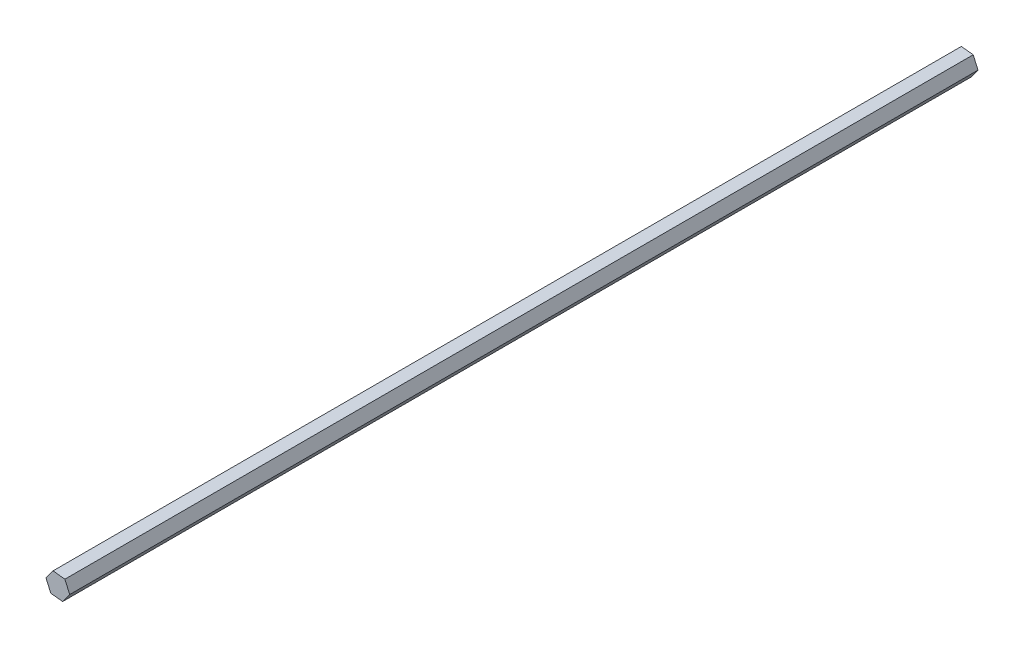
ISO-10303-21;
HEADER;
FILE_DESCRIPTION(('STEP AP214'),'2;1');
FILE_NAME('part.step','',(''),(''),'','','');
FILE_SCHEMA(('AUTOMOTIVE_DESIGN { 1 0 10303 214 1 1 1 1 }'));
ENDSEC;
DATA;
#1=APPLICATION_CONTEXT('core data for automotive mechanical design processes');
#2=APPLICATION_PROTOCOL_DEFINITION('international standard','automotive_design',2000,#1);
#3=PRODUCT_CONTEXT('',#1,'mechanical');
#4=PRODUCT('Part','Part','',(#3));
#5=PRODUCT_RELATED_PRODUCT_CATEGORY('part','',(#4));
#6=PRODUCT_DEFINITION_FORMATION('','',#4);
#7=PRODUCT_DEFINITION_CONTEXT('part definition',#1,'design');
#8=PRODUCT_DEFINITION('design','',#6,#7);
#9=PRODUCT_DEFINITION_SHAPE('','',#8);
#10=(LENGTH_UNIT() NAMED_UNIT(*) SI_UNIT(.MILLI.,.METRE.));
#11=(NAMED_UNIT(*) PLANE_ANGLE_UNIT() SI_UNIT($,.RADIAN.));
#12=(NAMED_UNIT(*) SI_UNIT($,.STERADIAN.) SOLID_ANGLE_UNIT());
#13=UNCERTAINTY_MEASURE_WITH_UNIT(LENGTH_MEASURE(1.E-05),#10,'distance_accuracy_value','');
#14=(GEOMETRIC_REPRESENTATION_CONTEXT(3) GLOBAL_UNCERTAINTY_ASSIGNED_CONTEXT((#13)) GLOBAL_UNIT_ASSIGNED_CONTEXT((#10,
#11,#12)) REPRESENTATION_CONTEXT('',''));
#15=CARTESIAN_POINT('',(0.,0.,0.));
#16=DIRECTION('',(0.,0.,1.));
#17=DIRECTION('',(1.,0.,0.));
#18=AXIS2_PLACEMENT_3D('',#15,#16,#17);
#19=CARTESIAN_POINT('',(7.28894855213655,-0.796594211402432,558.8));
#20=DIRECTION('',(-0.91521997258165,-0.402954590230269,0.));
#21=DIRECTION('',(0.402954590230269,-0.91521997258165,0.));
#22=AXIS2_PLACEMENT_3D('',#19,#20,#21);
#23=PLANE('',#22);
#24=DIRECTION('',(-0.402954590230269,0.91521997258165,0.));
#25=VECTOR('',#24,1.);
#26=CARTESIAN_POINT('',(7.28894855213655,-0.796594211402432,0.));
#27=LINE('',#26,#25);
#28=CARTESIAN_POINT('',(7.28894855213655,-0.796594211402432,0.));
#29=VERTEX_POINT('',#28);
#30=CARTESIAN_POINT('',(4.33434509965041,5.91411750732684,0.));
#31=VERTEX_POINT('',#30);
#32=EDGE_CURVE('E116',#29,#31,#27,.T.);
#33=ORIENTED_EDGE('',*,*,#32,.T.);
#34=DIRECTION('',(0.,0.,-1.));
#35=VECTOR('',#34,1.);
#36=CARTESIAN_POINT('',(4.33434509965041,5.91411750732684,558.8));
#37=LINE('',#36,#35);
#38=CARTESIAN_POINT('',(4.33434509965041,5.91411750732684,558.8));
#39=VERTEX_POINT('',#38);
#40=EDGE_CURVE('E11',#39,#31,#37,.T.);
#41=ORIENTED_EDGE('',*,*,#40,.F.);
#42=DIRECTION('',(-0.402954590230269,0.91521997258165,0.));
#43=VECTOR('',#42,1.);
#44=CARTESIAN_POINT('',(7.28894855213655,-0.796594211402432,558.8));
#45=LINE('',#44,#43);
#46=CARTESIAN_POINT('',(7.28894855213655,-0.796594211402432,558.8));
#47=VERTEX_POINT('',#46);
#48=EDGE_CURVE('E126',#47,#39,#45,.T.);
#49=ORIENTED_EDGE('',*,*,#48,.F.);
#50=DIRECTION('',(0.,0.,-1.));
#51=VECTOR('',#50,1.);
#52=CARTESIAN_POINT('',(7.28894855213655,-0.796594211402432,558.8));
#53=LINE('',#52,#51);
#54=EDGE_CURVE('E112',#47,#29,#53,.T.);
#55=ORIENTED_EDGE('',*,*,#54,.T.);
#56=EDGE_LOOP('',(#33,#41,#49,#55));
#57=FACE_BOUND('',#56,.T.);
#58=ADVANCED_FACE('F32',(#57),#23,.F.);
#59=CARTESIAN_POINT('',(4.33434509965041,5.91411750732684,558.8));
#60=DIRECTION('',(-0.108641074579864,-0.994081041421741,0.));
#61=DIRECTION('',(0.994081041421741,-0.108641074579864,0.));
#62=AXIS2_PLACEMENT_3D('',#59,#60,#61);
#63=PLANE('',#62);
#64=DIRECTION('',(-0.994081041421741,0.108641074579864,0.));
#65=VECTOR('',#64,1.);
#66=CARTESIAN_POINT('',(4.33434509965041,5.91411750732684,0.));
#67=LINE('',#66,#65);
#68=CARTESIAN_POINT('',(-2.95460345248614,6.71071171872927,0.));
#69=VERTEX_POINT('',#68);
#70=EDGE_CURVE('E119',#31,#69,#67,.T.);
#71=ORIENTED_EDGE('',*,*,#70,.T.);
#72=DIRECTION('',(0.,0.,-1.));
#73=VECTOR('',#72,1.);
#74=CARTESIAN_POINT('',(-2.95460345248614,6.71071171872927,558.8));
#75=LINE('',#74,#73);
#76=CARTESIAN_POINT('',(-2.95460345248614,6.71071171872927,558.8));
#77=VERTEX_POINT('',#76);
#78=EDGE_CURVE('E40',#77,#69,#75,.T.);
#79=ORIENTED_EDGE('',*,*,#78,.F.);
#80=DIRECTION('',(-0.994081041421741,0.108641074579864,0.));
#81=VECTOR('',#80,1.);
#82=CARTESIAN_POINT('',(4.33434509965041,5.91411750732684,558.8));
#83=LINE('',#82,#81);
#84=EDGE_CURVE('E85',#39,#77,#83,.T.);
#85=ORIENTED_EDGE('',*,*,#84,.F.);
#86=ORIENTED_EDGE('',*,*,#40,.T.);
#87=EDGE_LOOP('',(#71,#79,#85,#86));
#88=FACE_BOUND('',#87,.T.);
#89=ADVANCED_FACE('F150',(#88),#63,.F.);
#90=CARTESIAN_POINT('',(-2.95460345248614,6.71071171872927,558.8));
#91=DIRECTION('',(0.806578898001786,-0.591126451191472,0.));
#92=DIRECTION('',(0.591126451191472,0.806578898001786,0.));
#93=AXIS2_PLACEMENT_3D('',#90,#91,#92);
#94=PLANE('',#93);
#95=DIRECTION('',(-0.591126451191472,-0.806578898001786,0.));
#96=VECTOR('',#95,1.);
#97=CARTESIAN_POINT('',(-2.95460345248614,6.71071171872927,0.));
#98=LINE('',#97,#96);
#99=CARTESIAN_POINT('',(-7.28894855213655,0.796594211402431,0.));
#100=VERTEX_POINT('',#99);
#101=EDGE_CURVE('E121',#69,#100,#98,.T.);
#102=ORIENTED_EDGE('',*,*,#101,.T.);
#103=DIRECTION('',(0.,0.,-1.));
#104=VECTOR('',#103,1.);
#105=CARTESIAN_POINT('',(-7.28894855213655,0.796594211402431,558.8));
#106=LINE('',#105,#104);
#107=CARTESIAN_POINT('',(-7.28894855213655,0.796594211402431,558.8));
#108=VERTEX_POINT('',#107);
#109=EDGE_CURVE('E107',#108,#100,#106,.T.);
#110=ORIENTED_EDGE('',*,*,#109,.F.);
#111=DIRECTION('',(-0.591126451191472,-0.806578898001786,0.));
#112=VECTOR('',#111,1.);
#113=CARTESIAN_POINT('',(-2.95460345248614,6.71071171872927,558.8));
#114=LINE('',#113,#112);
#115=EDGE_CURVE('E98',#77,#108,#114,.T.);
#116=ORIENTED_EDGE('',*,*,#115,.F.);
#117=ORIENTED_EDGE('',*,*,#78,.T.);
#118=EDGE_LOOP('',(#102,#110,#116,#117));
#119=FACE_BOUND('',#118,.T.);
#120=ADVANCED_FACE('F132',(#119),#94,.F.);
#121=CARTESIAN_POINT('',(-7.28894855213655,0.796594211402431,558.8));
#122=DIRECTION('',(0.91521997258165,0.402954590230269,0.));
#123=DIRECTION('',(-0.402954590230269,0.91521997258165,0.));
#124=AXIS2_PLACEMENT_3D('',#121,#122,#123);
#125=PLANE('',#124);
#126=DIRECTION('',(0.402954590230269,-0.91521997258165,0.));
#127=VECTOR('',#126,1.);
#128=CARTESIAN_POINT('',(-7.28894855213655,0.796594211402431,0.));
#129=LINE('',#128,#127);
#130=CARTESIAN_POINT('',(-4.33434509965041,-5.91411750732684,0.));
#131=VERTEX_POINT('',#130);
#132=EDGE_CURVE('E106',#100,#131,#129,.T.);
#133=ORIENTED_EDGE('',*,*,#132,.T.);
#134=DIRECTION('',(0.,0.,-1.));
#135=VECTOR('',#134,1.);
#136=CARTESIAN_POINT('',(-4.33434509965041,-5.91411750732684,558.8));
#137=LINE('',#136,#135);
#138=CARTESIAN_POINT('',(-4.33434509965041,-5.91411750732684,558.8));
#139=VERTEX_POINT('',#138);
#140=EDGE_CURVE('E103',#139,#131,#137,.T.);
#141=ORIENTED_EDGE('',*,*,#140,.F.);
#142=DIRECTION('',(0.402954590230269,-0.91521997258165,0.));
#143=VECTOR('',#142,1.);
#144=CARTESIAN_POINT('',(-7.28894855213655,0.796594211402431,558.8));
#145=LINE('',#144,#143);
#146=EDGE_CURVE('E92',#108,#139,#145,.T.);
#147=ORIENTED_EDGE('',*,*,#146,.F.);
#148=ORIENTED_EDGE('',*,*,#109,.T.);
#149=EDGE_LOOP('',(#133,#141,#147,#148));
#150=FACE_BOUND('',#149,.T.);
#151=ADVANCED_FACE('F104',(#150),#125,.F.);
#152=CARTESIAN_POINT('',(-4.33434509965041,-5.91411750732684,558.8));
#153=DIRECTION('',(0.108641074579864,0.994081041421741,0.));
#154=DIRECTION('',(-0.994081041421741,0.108641074579864,0.));
#155=AXIS2_PLACEMENT_3D('',#152,#153,#154);
#156=PLANE('',#155);
#157=DIRECTION('',(0.994081041421741,-0.108641074579864,0.));
#158=VECTOR('',#157,1.);
#159=CARTESIAN_POINT('',(-4.33434509965041,-5.91411750732684,0.));
#160=LINE('',#159,#158);
#161=CARTESIAN_POINT('',(2.95460345248614,-6.71071171872927,0.));
#162=VERTEX_POINT('',#161);
#163=EDGE_CURVE('E71',#131,#162,#160,.T.);
#164=ORIENTED_EDGE('',*,*,#163,.T.);
#165=DIRECTION('',(0.,0.,-1.));
#166=VECTOR('',#165,1.);
#167=CARTESIAN_POINT('',(2.95460345248614,-6.71071171872927,558.8));
#168=LINE('',#167,#166);
#169=CARTESIAN_POINT('',(2.95460345248614,-6.71071171872927,558.8));
#170=VERTEX_POINT('',#169);
#171=EDGE_CURVE('E108',#170,#162,#168,.T.);
#172=ORIENTED_EDGE('',*,*,#171,.F.);
#173=DIRECTION('',(0.994081041421741,-0.108641074579864,0.));
#174=VECTOR('',#173,1.);
#175=CARTESIAN_POINT('',(-4.33434509965041,-5.91411750732684,558.8));
#176=LINE('',#175,#174);
#177=EDGE_CURVE('E96',#139,#170,#176,.T.);
#178=ORIENTED_EDGE('',*,*,#177,.F.);
#179=ORIENTED_EDGE('',*,*,#140,.T.);
#180=EDGE_LOOP('',(#164,#172,#178,#179));
#181=FACE_BOUND('',#180,.T.);
#182=ADVANCED_FACE('F110',(#181),#156,.F.);
#183=CARTESIAN_POINT('',(2.95460345248614,-6.71071171872927,558.8));
#184=DIRECTION('',(-0.806578898001786,0.591126451191472,0.));
#185=DIRECTION('',(-0.591126451191472,-0.806578898001786,0.));
#186=AXIS2_PLACEMENT_3D('',#183,#184,#185);
#187=PLANE('',#186);
#188=DIRECTION('',(0.591126451191472,0.806578898001786,0.));
#189=VECTOR('',#188,1.);
#190=CARTESIAN_POINT('',(2.95460345248614,-6.71071171872927,0.));
#191=LINE('',#190,#189);
#192=EDGE_CURVE('E77',#162,#29,#191,.T.);
#193=ORIENTED_EDGE('',*,*,#192,.T.);
#194=ORIENTED_EDGE('',*,*,#54,.F.);
#195=DIRECTION('',(0.591126451191472,0.806578898001786,0.));
#196=VECTOR('',#195,1.);
#197=CARTESIAN_POINT('',(2.95460345248614,-6.71071171872927,558.8));
#198=LINE('',#197,#196);
#199=EDGE_CURVE('E48',#170,#47,#198,.T.);
#200=ORIENTED_EDGE('',*,*,#199,.F.);
#201=ORIENTED_EDGE('',*,*,#171,.T.);
#202=EDGE_LOOP('',(#193,#194,#200,#201));
#203=FACE_BOUND('',#202,.T.);
#204=ADVANCED_FACE('F139',(#203),#187,.F.);
#205=CARTESIAN_POINT('',(0.,0.,558.8));
#206=DIRECTION('',(0.,0.,1.));
#207=DIRECTION('',(1.,0.,0.));
#208=AXIS2_PLACEMENT_3D('',#205,#206,#207);
#209=PLANE('',#208);
#210=ORIENTED_EDGE('',*,*,#48,.T.);
#211=ORIENTED_EDGE('',*,*,#84,.T.);
#212=ORIENTED_EDGE('',*,*,#115,.T.);
#213=ORIENTED_EDGE('',*,*,#146,.T.);
#214=ORIENTED_EDGE('',*,*,#177,.T.);
#215=ORIENTED_EDGE('',*,*,#199,.T.);
#216=EDGE_LOOP('',(#210,#211,#212,#213,#214,#215));
#217=FACE_BOUND('',#216,.T.);
#218=ADVANCED_FACE('F94',(#217),#209,.T.);
#219=CARTESIAN_POINT('',(0.,0.,0.));
#220=DIRECTION('',(0.,0.,1.));
#221=DIRECTION('',(1.,0.,0.));
#222=AXIS2_PLACEMENT_3D('',#219,#220,#221);
#223=PLANE('',#222);
#224=ORIENTED_EDGE('',*,*,#32,.F.);
#225=ORIENTED_EDGE('',*,*,#192,.F.);
#226=ORIENTED_EDGE('',*,*,#163,.F.);
#227=ORIENTED_EDGE('',*,*,#132,.F.);
#228=ORIENTED_EDGE('',*,*,#101,.F.);
#229=ORIENTED_EDGE('',*,*,#70,.F.);
#230=EDGE_LOOP('',(#224,#225,#226,#227,#228,#229));
#231=FACE_BOUND('',#230,.T.);
#232=ADVANCED_FACE('F135',(#231),#223,.F.);
#233=CLOSED_SHELL('',(#58,#89,#120,#151,#182,#204,#218,#232));
#234=MANIFOLD_SOLID_BREP('B2',#233);
#235=ADVANCED_BREP_SHAPE_REPRESENTATION('',(#18,#234),#14);
#236=SHAPE_DEFINITION_REPRESENTATION(#9,#235);
ENDSEC;
END-ISO-10303-21;
